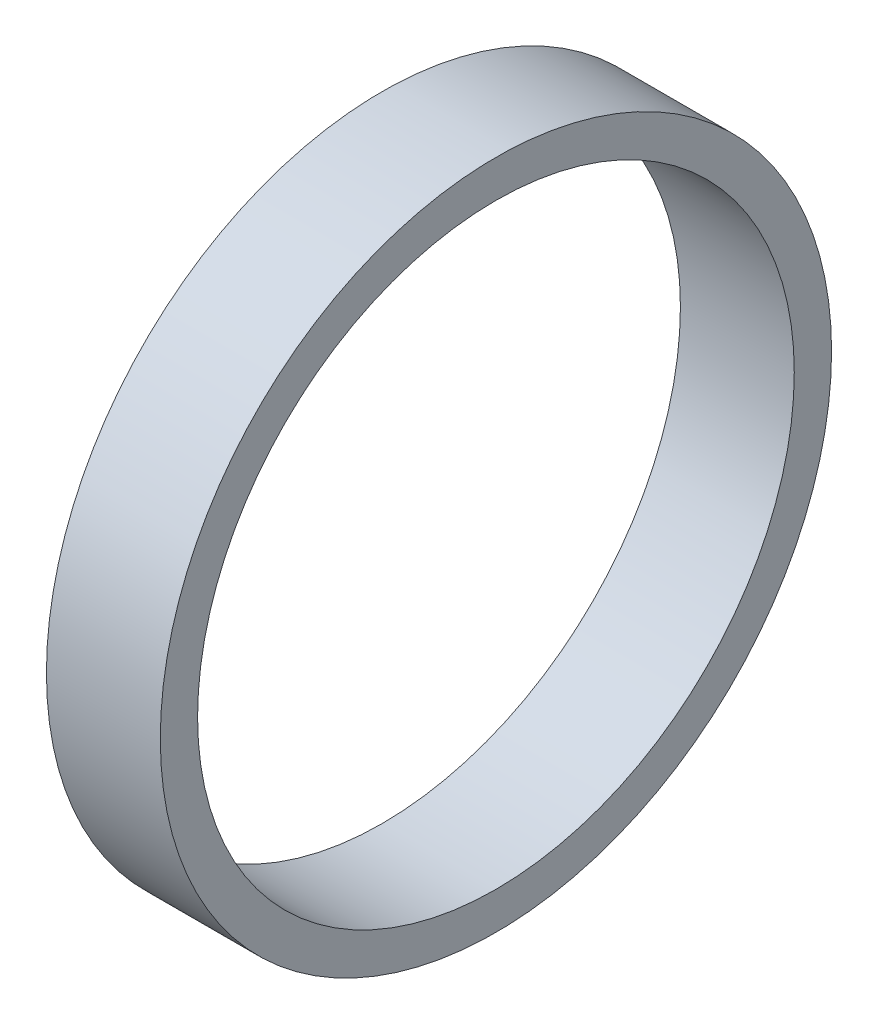
ISO-10303-21;
HEADER;
FILE_DESCRIPTION(('STEP AP214'),'2;1');
FILE_NAME('part.step','',(''),(''),'','','');
FILE_SCHEMA(('AUTOMOTIVE_DESIGN { 1 0 10303 214 1 1 1 1 }'));
ENDSEC;
DATA;
#1=APPLICATION_CONTEXT('core data for automotive mechanical design processes');
#2=APPLICATION_PROTOCOL_DEFINITION('international standard','automotive_design',2000,#1);
#3=PRODUCT_CONTEXT('',#1,'mechanical');
#4=PRODUCT('Part','Part','',(#3));
#5=PRODUCT_RELATED_PRODUCT_CATEGORY('part','',(#4));
#6=PRODUCT_DEFINITION_FORMATION('','',#4);
#7=PRODUCT_DEFINITION_CONTEXT('part definition',#1,'design');
#8=PRODUCT_DEFINITION('design','',#6,#7);
#9=PRODUCT_DEFINITION_SHAPE('','',#8);
#10=(LENGTH_UNIT() NAMED_UNIT(*) SI_UNIT(.MILLI.,.METRE.));
#11=(NAMED_UNIT(*) PLANE_ANGLE_UNIT() SI_UNIT($,.RADIAN.));
#12=(NAMED_UNIT(*) SI_UNIT($,.STERADIAN.) SOLID_ANGLE_UNIT());
#13=UNCERTAINTY_MEASURE_WITH_UNIT(LENGTH_MEASURE(1.E-05),#10,'distance_accuracy_value','');
#14=(GEOMETRIC_REPRESENTATION_CONTEXT(3) GLOBAL_UNCERTAINTY_ASSIGNED_CONTEXT((#13)) GLOBAL_UNIT_ASSIGNED_CONTEXT((#10,
#11,#12)) REPRESENTATION_CONTEXT('',''));
#15=CARTESIAN_POINT('',(0.,0.,0.));
#16=DIRECTION('',(0.,0.,1.));
#17=DIRECTION('',(1.,0.,0.));
#18=AXIS2_PLACEMENT_3D('',#15,#16,#17);
#19=CARTESIAN_POINT('',(5.725,0.,0.));
#20=DIRECTION('',(1.,0.,0.));
#21=DIRECTION('',(0.,0.,-1.));
#22=AXIS2_PLACEMENT_3D('',#19,#20,#21);
#23=PLANE('',#22);
#24=CARTESIAN_POINT('',(5.725,0.,0.));
#25=DIRECTION('',(1.,0.,0.));
#26=DIRECTION('',(0.,0.,-1.));
#27=AXIS2_PLACEMENT_3D('',#24,#25,#26);
#28=CIRCLE('',#27,33.75);
#29=CARTESIAN_POINT('',(5.725,0.,-33.75));
#30=VERTEX_POINT('',#29);
#31=EDGE_CURVE('E10',#30,#30,#28,.T.);
#32=ORIENTED_EDGE('',*,*,#31,.T.);
#33=EDGE_LOOP('',(#32));
#34=FACE_BOUND('',#33,.T.);
#35=CARTESIAN_POINT('',(5.725,0.,0.));
#36=DIRECTION('',(1.,0.,0.));
#37=DIRECTION('',(0.,0.,-1.));
#38=AXIS2_PLACEMENT_3D('',#35,#36,#37);
#39=CIRCLE('',#38,30.);
#40=CARTESIAN_POINT('',(5.725,0.,-30.));
#41=VERTEX_POINT('',#40);
#42=EDGE_CURVE('E50',#41,#41,#39,.T.);
#43=ORIENTED_EDGE('',*,*,#42,.F.);
#44=EDGE_LOOP('',(#43));
#45=FACE_BOUND('',#44,.T.);
#46=ADVANCED_FACE('F39',(#34,#45),#23,.T.);
#47=CARTESIAN_POINT('',(-5.725,0.,0.));
#48=DIRECTION('',(1.,0.,0.));
#49=DIRECTION('',(0.,0.,-1.));
#50=AXIS2_PLACEMENT_3D('',#47,#48,#49);
#51=PLANE('',#50);
#52=CARTESIAN_POINT('',(-5.725,0.,0.));
#53=DIRECTION('',(1.,0.,0.));
#54=DIRECTION('',(0.,0.,-1.));
#55=AXIS2_PLACEMENT_3D('',#52,#53,#54);
#56=CIRCLE('',#55,33.75);
#57=CARTESIAN_POINT('',(-5.725,0.,-33.75));
#58=VERTEX_POINT('',#57);
#59=EDGE_CURVE('E43',#58,#58,#56,.T.);
#60=ORIENTED_EDGE('',*,*,#59,.F.);
#61=EDGE_LOOP('',(#60));
#62=FACE_BOUND('',#61,.T.);
#63=CARTESIAN_POINT('',(-5.725,0.,0.));
#64=DIRECTION('',(1.,0.,0.));
#65=DIRECTION('',(0.,0.,-1.));
#66=AXIS2_PLACEMENT_3D('',#63,#64,#65);
#67=CIRCLE('',#66,30.);
#68=CARTESIAN_POINT('',(-5.725,0.,-30.));
#69=VERTEX_POINT('',#68);
#70=EDGE_CURVE('E52',#69,#69,#67,.T.);
#71=ORIENTED_EDGE('',*,*,#70,.T.);
#72=EDGE_LOOP('',(#71));
#73=FACE_BOUND('',#72,.T.);
#74=ADVANCED_FACE('F62',(#62,#73),#51,.F.);
#75=CARTESIAN_POINT('',(5.725,0.,0.));
#76=DIRECTION('',(-1.,0.,0.));
#77=DIRECTION('',(0.,0.,1.));
#78=AXIS2_PLACEMENT_3D('',#75,#76,#77);
#79=CYLINDRICAL_SURFACE('',#78,33.75);
#80=ORIENTED_EDGE('',*,*,#31,.F.);
#81=EDGE_LOOP('',(#80));
#82=FACE_BOUND('',#81,.T.);
#83=ORIENTED_EDGE('',*,*,#59,.T.);
#84=EDGE_LOOP('',(#83));
#85=FACE_BOUND('',#84,.T.);
#86=ADVANCED_FACE('F41',(#82,#85),#79,.T.);
#87=CARTESIAN_POINT('',(5.725,0.,0.));
#88=DIRECTION('',(-1.,0.,0.));
#89=DIRECTION('',(0.,0.,1.));
#90=AXIS2_PLACEMENT_3D('',#87,#88,#89);
#91=CYLINDRICAL_SURFACE('',#90,30.);
#92=ORIENTED_EDGE('',*,*,#42,.T.);
#93=EDGE_LOOP('',(#92));
#94=FACE_BOUND('',#93,.T.);
#95=ORIENTED_EDGE('',*,*,#70,.F.);
#96=EDGE_LOOP('',(#95));
#97=FACE_BOUND('',#96,.T.);
#98=ADVANCED_FACE('F58',(#94,#97),#91,.F.);
#99=CLOSED_SHELL('',(#46,#74,#86,#98));
#100=MANIFOLD_SOLID_BREP('B2',#99);
#101=ADVANCED_BREP_SHAPE_REPRESENTATION('',(#18,#100),#14);
#102=SHAPE_DEFINITION_REPRESENTATION(#9,#101);
ENDSEC;
END-ISO-10303-21;
